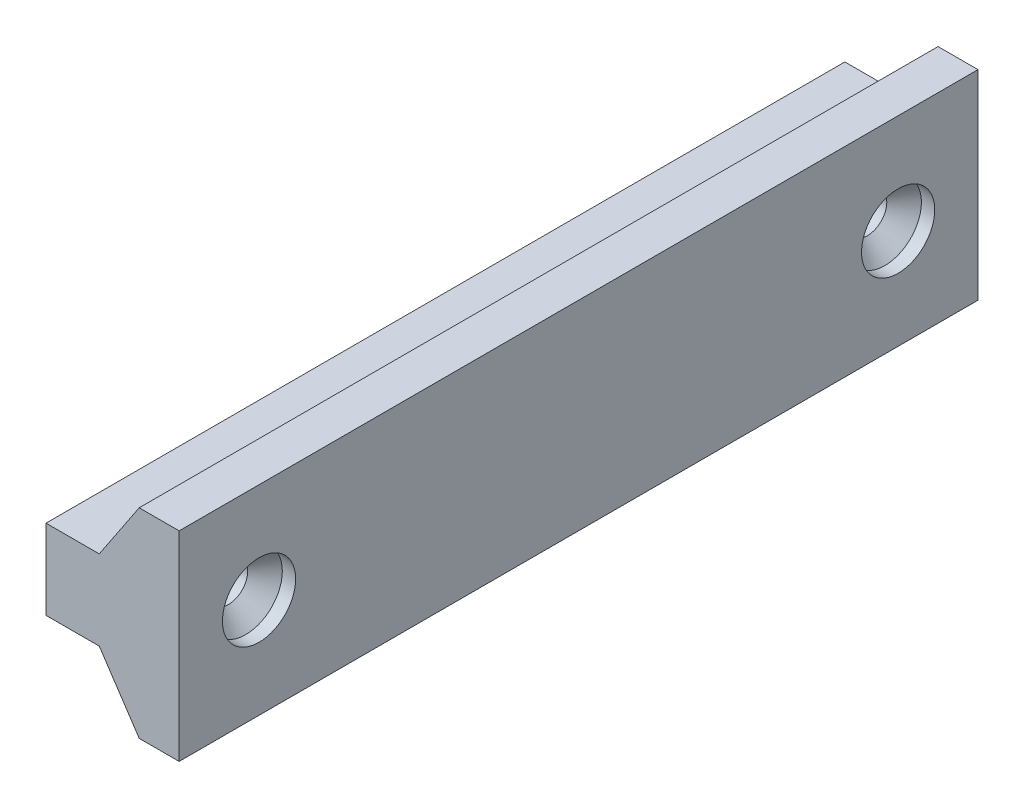
ISO-10303-21;
HEADER;
FILE_DESCRIPTION(('STEP AP214'),'2;1');
FILE_NAME('part.step','',(''),(''),'','','');
FILE_SCHEMA(('AUTOMOTIVE_DESIGN { 1 0 10303 214 1 1 1 1 }'));
ENDSEC;
DATA;
#1=APPLICATION_CONTEXT('core data for automotive mechanical design processes');
#2=APPLICATION_PROTOCOL_DEFINITION('international standard','automotive_design',2000,#1);
#3=PRODUCT_CONTEXT('',#1,'mechanical');
#4=PRODUCT('Part','Part','',(#3));
#5=PRODUCT_RELATED_PRODUCT_CATEGORY('part','',(#4));
#6=PRODUCT_DEFINITION_FORMATION('','',#4);
#7=PRODUCT_DEFINITION_CONTEXT('part definition',#1,'design');
#8=PRODUCT_DEFINITION('design','',#6,#7);
#9=PRODUCT_DEFINITION_SHAPE('','',#8);
#10=(LENGTH_UNIT() NAMED_UNIT(*) SI_UNIT(.MILLI.,.METRE.));
#11=(NAMED_UNIT(*) PLANE_ANGLE_UNIT() SI_UNIT($,.RADIAN.));
#12=(NAMED_UNIT(*) SI_UNIT($,.STERADIAN.) SOLID_ANGLE_UNIT());
#13=UNCERTAINTY_MEASURE_WITH_UNIT(LENGTH_MEASURE(1.E-05),#10,'distance_accuracy_value','');
#14=(GEOMETRIC_REPRESENTATION_CONTEXT(3) GLOBAL_UNCERTAINTY_ASSIGNED_CONTEXT((#13)) GLOBAL_UNIT_ASSIGNED_CONTEXT((#10,
#11,#12)) REPRESENTATION_CONTEXT('',''));
#15=CARTESIAN_POINT('',(0.,0.,0.));
#16=DIRECTION('',(0.,0.,1.));
#17=DIRECTION('',(1.,0.,0.));
#18=AXIS2_PLACEMENT_3D('',#15,#16,#17);
#19=CARTESIAN_POINT('',(-3.,-7.5,30.));
#20=DIRECTION('',(0.,1.,0.));
#21=DIRECTION('',(0.,0.,1.));
#22=AXIS2_PLACEMENT_3D('',#19,#20,#21);
#23=PLANE('',#22);
#24=DIRECTION('',(1.,0.,0.));
#25=VECTOR('',#24,1.);
#26=CARTESIAN_POINT('',(-3.,-7.5,-30.));
#27=LINE('',#26,#25);
#28=CARTESIAN_POINT('',(-3.,-7.5,-30.));
#29=VERTEX_POINT('',#28);
#30=CARTESIAN_POINT('',(0.,-7.5,-30.));
#31=VERTEX_POINT('',#30);
#32=EDGE_CURVE('E140',#29,#31,#27,.T.);
#33=ORIENTED_EDGE('',*,*,#32,.T.);
#34=DIRECTION('',(0.,0.,-1.));
#35=VECTOR('',#34,1.);
#36=CARTESIAN_POINT('',(0.,-7.5,30.));
#37=LINE('',#36,#35);
#38=CARTESIAN_POINT('',(0.,-7.5,30.));
#39=VERTEX_POINT('',#38);
#40=EDGE_CURVE('E11',#39,#31,#37,.T.);
#41=ORIENTED_EDGE('',*,*,#40,.F.);
#42=DIRECTION('',(1.,0.,0.));
#43=VECTOR('',#42,1.);
#44=CARTESIAN_POINT('',(-3.,-7.5,30.));
#45=LINE('',#44,#43);
#46=CARTESIAN_POINT('',(-3.,-7.5,30.));
#47=VERTEX_POINT('',#46);
#48=EDGE_CURVE('E163',#47,#39,#45,.T.);
#49=ORIENTED_EDGE('',*,*,#48,.F.);
#50=DIRECTION('',(0.,0.,-1.));
#51=VECTOR('',#50,1.);
#52=CARTESIAN_POINT('',(-3.,-7.5,30.));
#53=LINE('',#52,#51);
#54=EDGE_CURVE('E136',#47,#29,#53,.T.);
#55=ORIENTED_EDGE('',*,*,#54,.T.);
#56=EDGE_LOOP('',(#33,#41,#49,#55));
#57=FACE_BOUND('',#56,.T.);
#58=ADVANCED_FACE('F39',(#57),#23,.F.);
#59=CARTESIAN_POINT('',(0.,7.5,30.));
#60=DIRECTION('',(-1.,0.,0.));
#61=DIRECTION('',(0.,0.,1.));
#62=AXIS2_PLACEMENT_3D('',#59,#60,#61);
#63=PLANE('',#62);
#64=CARTESIAN_POINT('',(0.,0.,24.));
#65=DIRECTION('',(1.,0.,0.));
#66=DIRECTION('',(0.,0.,-1.));
#67=AXIS2_PLACEMENT_3D('',#64,#65,#66);
#68=CIRCLE('',#67,2.75);
#69=CARTESIAN_POINT('',(0.,0.,21.25));
#70=VERTEX_POINT('',#69);
#71=EDGE_CURVE('E145',#70,#70,#68,.T.);
#72=ORIENTED_EDGE('',*,*,#71,.F.);
#73=EDGE_LOOP('',(#72));
#74=FACE_BOUND('',#73,.T.);
#75=CARTESIAN_POINT('',(0.,0.,-24.));
#76=DIRECTION('',(1.,0.,0.));
#77=DIRECTION('',(0.,0.,-1.));
#78=AXIS2_PLACEMENT_3D('',#75,#76,#77);
#79=CIRCLE('',#78,2.75);
#80=CARTESIAN_POINT('',(0.,0.,-26.75));
#81=VERTEX_POINT('',#80);
#82=EDGE_CURVE('E207',#81,#81,#79,.T.);
#83=ORIENTED_EDGE('',*,*,#82,.F.);
#84=EDGE_LOOP('',(#83));
#85=FACE_BOUND('',#84,.T.);
#86=DIRECTION('',(0.,1.,0.));
#87=VECTOR('',#86,1.);
#88=CARTESIAN_POINT('',(0.,7.5,-30.));
#89=LINE('',#88,#87);
#90=CARTESIAN_POINT('',(0.,7.5,-30.));
#91=VERTEX_POINT('',#90);
#92=EDGE_CURVE('E144',#31,#91,#89,.T.);
#93=ORIENTED_EDGE('',*,*,#92,.T.);
#94=DIRECTION('',(0.,0.,-1.));
#95=VECTOR('',#94,1.);
#96=CARTESIAN_POINT('',(0.,7.5,30.));
#97=LINE('',#96,#95);
#98=CARTESIAN_POINT('',(0.,7.5,30.));
#99=VERTEX_POINT('',#98);
#100=EDGE_CURVE('E48',#99,#91,#97,.T.);
#101=ORIENTED_EDGE('',*,*,#100,.F.);
#102=DIRECTION('',(0.,1.,0.));
#103=VECTOR('',#102,1.);
#104=CARTESIAN_POINT('',(0.,7.5,30.));
#105=LINE('',#104,#103);
#106=EDGE_CURVE('E99',#39,#99,#105,.T.);
#107=ORIENTED_EDGE('',*,*,#106,.F.);
#108=ORIENTED_EDGE('',*,*,#40,.T.);
#109=EDGE_LOOP('',(#93,#101,#107,#108));
#110=FACE_BOUND('',#109,.T.);
#111=ADVANCED_FACE('F249',(#74,#85,#110),#63,.F.);
#112=CARTESIAN_POINT('',(-3.,7.5,30.));
#113=DIRECTION('',(0.,-1.,0.));
#114=DIRECTION('',(0.,0.,-1.));
#115=AXIS2_PLACEMENT_3D('',#112,#113,#114);
#116=PLANE('',#115);
#117=DIRECTION('',(-1.,0.,0.));
#118=VECTOR('',#117,1.);
#119=CARTESIAN_POINT('',(-3.,7.5,-30.));
#120=LINE('',#119,#118);
#121=CARTESIAN_POINT('',(-3.,7.5,-30.));
#122=VERTEX_POINT('',#121);
#123=EDGE_CURVE('E148',#91,#122,#120,.T.);
#124=ORIENTED_EDGE('',*,*,#123,.T.);
#125=DIRECTION('',(0.,0.,-1.));
#126=VECTOR('',#125,1.);
#127=CARTESIAN_POINT('',(-3.,7.5,30.));
#128=LINE('',#127,#126);
#129=CARTESIAN_POINT('',(-3.,7.5,30.));
#130=VERTEX_POINT('',#129);
#131=EDGE_CURVE('E174',#130,#122,#128,.T.);
#132=ORIENTED_EDGE('',*,*,#131,.F.);
#133=DIRECTION('',(-1.,0.,0.));
#134=VECTOR('',#133,1.);
#135=CARTESIAN_POINT('',(-3.,7.5,30.));
#136=LINE('',#135,#134);
#137=EDGE_CURVE('E184',#99,#130,#136,.T.);
#138=ORIENTED_EDGE('',*,*,#137,.F.);
#139=ORIENTED_EDGE('',*,*,#100,.T.);
#140=EDGE_LOOP('',(#124,#132,#138,#139));
#141=FACE_BOUND('',#140,.T.);
#142=ADVANCED_FACE('F182',(#141),#116,.F.);
#143=CARTESIAN_POINT('',(-6.,3.,30.));
#144=DIRECTION('',(0.832050294337844,-0.554700196225229,0.));
#145=DIRECTION('',(0.554700196225229,0.832050294337844,0.));
#146=AXIS2_PLACEMENT_3D('',#143,#144,#145);
#147=PLANE('',#146);
#148=DIRECTION('',(-0.554700196225229,-0.832050294337844,0.));
#149=VECTOR('',#148,1.);
#150=CARTESIAN_POINT('',(-6.,3.,-30.));
#151=LINE('',#150,#149);
#152=CARTESIAN_POINT('',(-6.,3.,-30.));
#153=VERTEX_POINT('',#152);
#154=EDGE_CURVE('E151',#122,#153,#151,.T.);
#155=ORIENTED_EDGE('',*,*,#154,.T.);
#156=DIRECTION('',(0.,0.,-1.));
#157=VECTOR('',#156,1.);
#158=CARTESIAN_POINT('',(-6.,3.,30.));
#159=LINE('',#158,#157);
#160=CARTESIAN_POINT('',(-6.,3.,30.));
#161=VERTEX_POINT('',#160);
#162=EDGE_CURVE('E170',#161,#153,#159,.T.);
#163=ORIENTED_EDGE('',*,*,#162,.F.);
#164=DIRECTION('',(-0.554700196225229,-0.832050294337844,0.));
#165=VECTOR('',#164,1.);
#166=CARTESIAN_POINT('',(-6.,3.,30.));
#167=LINE('',#166,#165);
#168=EDGE_CURVE('E197',#130,#161,#167,.T.);
#169=ORIENTED_EDGE('',*,*,#168,.F.);
#170=ORIENTED_EDGE('',*,*,#131,.T.);
#171=EDGE_LOOP('',(#155,#163,#169,#170));
#172=FACE_BOUND('',#171,.T.);
#173=ADVANCED_FACE('F192',(#172),#147,.F.);
#174=CARTESIAN_POINT('',(-10.,3.,30.));
#175=DIRECTION('',(0.,-1.,0.));
#176=DIRECTION('',(0.,0.,-1.));
#177=AXIS2_PLACEMENT_3D('',#174,#175,#176);
#178=PLANE('',#177);
#179=DIRECTION('',(-1.,0.,0.));
#180=VECTOR('',#179,1.);
#181=CARTESIAN_POINT('',(-10.,3.,-30.));
#182=LINE('',#181,#180);
#183=CARTESIAN_POINT('',(-10.,3.,-30.));
#184=VERTEX_POINT('',#183);
#185=EDGE_CURVE('E154',#153,#184,#182,.T.);
#186=ORIENTED_EDGE('',*,*,#185,.T.);
#187=DIRECTION('',(0.,0.,-1.));
#188=VECTOR('',#187,1.);
#189=CARTESIAN_POINT('',(-10.,3.,30.));
#190=LINE('',#189,#188);
#191=CARTESIAN_POINT('',(-10.,3.,30.));
#192=VERTEX_POINT('',#191);
#193=EDGE_CURVE('E129',#192,#184,#190,.T.);
#194=ORIENTED_EDGE('',*,*,#193,.F.);
#195=DIRECTION('',(-1.,0.,0.));
#196=VECTOR('',#195,1.);
#197=CARTESIAN_POINT('',(-10.,3.,30.));
#198=LINE('',#197,#196);
#199=EDGE_CURVE('E118',#161,#192,#198,.T.);
#200=ORIENTED_EDGE('',*,*,#199,.F.);
#201=ORIENTED_EDGE('',*,*,#162,.T.);
#202=EDGE_LOOP('',(#186,#194,#200,#201));
#203=FACE_BOUND('',#202,.T.);
#204=ADVANCED_FACE('F195',(#203),#178,.F.);
#205=CARTESIAN_POINT('',(-10.,-3.,30.));
#206=DIRECTION('',(1.,0.,0.));
#207=DIRECTION('',(0.,0.,-1.));
#208=AXIS2_PLACEMENT_3D('',#205,#206,#207);
#209=PLANE('',#208);
#210=CARTESIAN_POINT('',(-10.,0.,24.));
#211=DIRECTION('',(1.,0.,0.));
#212=DIRECTION('',(0.,0.,-1.));
#213=AXIS2_PLACEMENT_3D('',#210,#211,#212);
#214=CIRCLE('',#213,1.45);
#215=CARTESIAN_POINT('',(-10.,0.,22.55));
#216=VERTEX_POINT('',#215);
#217=EDGE_CURVE('E226',#216,#216,#214,.T.);
#218=ORIENTED_EDGE('',*,*,#217,.T.);
#219=EDGE_LOOP('',(#218));
#220=FACE_BOUND('',#219,.T.);
#221=CARTESIAN_POINT('',(-10.,0.,-24.));
#222=DIRECTION('',(1.,0.,0.));
#223=DIRECTION('',(0.,0.,-1.));
#224=AXIS2_PLACEMENT_3D('',#221,#222,#223);
#225=CIRCLE('',#224,1.45);
#226=CARTESIAN_POINT('',(-10.,0.,-25.45));
#227=VERTEX_POINT('',#226);
#228=EDGE_CURVE('E211',#227,#227,#225,.T.);
#229=ORIENTED_EDGE('',*,*,#228,.T.);
#230=EDGE_LOOP('',(#229));
#231=FACE_BOUND('',#230,.T.);
#232=DIRECTION('',(0.,-1.,0.));
#233=VECTOR('',#232,1.);
#234=CARTESIAN_POINT('',(-10.,-3.,-30.));
#235=LINE('',#234,#233);
#236=CARTESIAN_POINT('',(-10.,-3.,-30.));
#237=VERTEX_POINT('',#236);
#238=EDGE_CURVE('E127',#184,#237,#235,.T.);
#239=ORIENTED_EDGE('',*,*,#238,.T.);
#240=DIRECTION('',(0.,0.,-1.));
#241=VECTOR('',#240,1.);
#242=CARTESIAN_POINT('',(-10.,-3.,30.));
#243=LINE('',#242,#241);
#244=CARTESIAN_POINT('',(-10.,-3.,30.));
#245=VERTEX_POINT('',#244);
#246=EDGE_CURVE('E124',#245,#237,#243,.T.);
#247=ORIENTED_EDGE('',*,*,#246,.F.);
#248=DIRECTION('',(0.,-1.,0.));
#249=VECTOR('',#248,1.);
#250=CARTESIAN_POINT('',(-10.,-3.,30.));
#251=LINE('',#250,#249);
#252=EDGE_CURVE('E112',#192,#245,#251,.T.);
#253=ORIENTED_EDGE('',*,*,#252,.F.);
#254=ORIENTED_EDGE('',*,*,#193,.T.);
#255=EDGE_LOOP('',(#239,#247,#253,#254));
#256=FACE_BOUND('',#255,.T.);
#257=ADVANCED_FACE('F125',(#220,#231,#256),#209,.F.);
#258=CARTESIAN_POINT('',(-10.,-3.,30.));
#259=DIRECTION('',(0.,1.,0.));
#260=DIRECTION('',(0.,0.,1.));
#261=AXIS2_PLACEMENT_3D('',#258,#259,#260);
#262=PLANE('',#261);
#263=DIRECTION('',(1.,0.,0.));
#264=VECTOR('',#263,1.);
#265=CARTESIAN_POINT('',(-10.,-3.,-30.));
#266=LINE('',#265,#264);
#267=CARTESIAN_POINT('',(-6.,-3.,-30.));
#268=VERTEX_POINT('',#267);
#269=EDGE_CURVE('E85',#237,#268,#266,.T.);
#270=ORIENTED_EDGE('',*,*,#269,.T.);
#271=DIRECTION('',(0.,0.,-1.));
#272=VECTOR('',#271,1.);
#273=CARTESIAN_POINT('',(-6.,-3.,30.));
#274=LINE('',#273,#272);
#275=CARTESIAN_POINT('',(-6.,-3.,30.));
#276=VERTEX_POINT('',#275);
#277=EDGE_CURVE('E130',#276,#268,#274,.T.);
#278=ORIENTED_EDGE('',*,*,#277,.F.);
#279=DIRECTION('',(1.,0.,0.));
#280=VECTOR('',#279,1.);
#281=CARTESIAN_POINT('',(-10.,-3.,30.));
#282=LINE('',#281,#280);
#283=EDGE_CURVE('E116',#245,#276,#282,.T.);
#284=ORIENTED_EDGE('',*,*,#283,.F.);
#285=ORIENTED_EDGE('',*,*,#246,.T.);
#286=EDGE_LOOP('',(#270,#278,#284,#285));
#287=FACE_BOUND('',#286,.T.);
#288=ADVANCED_FACE('F132',(#287),#262,.F.);
#289=CARTESIAN_POINT('',(-6.,-3.,30.));
#290=DIRECTION('',(0.832050294337844,0.554700196225229,0.));
#291=DIRECTION('',(-0.554700196225229,0.832050294337844,0.));
#292=AXIS2_PLACEMENT_3D('',#289,#290,#291);
#293=PLANE('',#292);
#294=DIRECTION('',(0.554700196225229,-0.832050294337844,0.));
#295=VECTOR('',#294,1.);
#296=CARTESIAN_POINT('',(-6.,-3.,-30.));
#297=LINE('',#296,#295);
#298=EDGE_CURVE('E91',#268,#29,#297,.T.);
#299=ORIENTED_EDGE('',*,*,#298,.T.);
#300=ORIENTED_EDGE('',*,*,#54,.F.);
#301=DIRECTION('',(0.554700196225229,-0.832050294337844,0.));
#302=VECTOR('',#301,1.);
#303=CARTESIAN_POINT('',(-6.,-3.,30.));
#304=LINE('',#303,#302);
#305=EDGE_CURVE('E56',#276,#47,#304,.T.);
#306=ORIENTED_EDGE('',*,*,#305,.F.);
#307=ORIENTED_EDGE('',*,*,#277,.T.);
#308=EDGE_LOOP('',(#299,#300,#306,#307));
#309=FACE_BOUND('',#308,.T.);
#310=ADVANCED_FACE('F256',(#309),#293,.F.);
#311=CARTESIAN_POINT('',(0.,0.,30.));
#312=DIRECTION('',(0.,0.,-1.));
#313=DIRECTION('',(-1.,0.,0.));
#314=AXIS2_PLACEMENT_3D('',#311,#312,#313);
#315=PLANE('',#314);
#316=ORIENTED_EDGE('',*,*,#48,.T.);
#317=ORIENTED_EDGE('',*,*,#106,.T.);
#318=ORIENTED_EDGE('',*,*,#137,.T.);
#319=ORIENTED_EDGE('',*,*,#168,.T.);
#320=ORIENTED_EDGE('',*,*,#199,.T.);
#321=ORIENTED_EDGE('',*,*,#252,.T.);
#322=ORIENTED_EDGE('',*,*,#283,.T.);
#323=ORIENTED_EDGE('',*,*,#305,.T.);
#324=EDGE_LOOP('',(#316,#317,#318,#319,#320,#321,#322,#323));
#325=FACE_BOUND('',#324,.T.);
#326=ADVANCED_FACE('F114',(#325),#315,.F.);
#327=CARTESIAN_POINT('',(0.,0.,-30.));
#328=DIRECTION('',(0.,0.,-1.));
#329=DIRECTION('',(-1.,0.,0.));
#330=AXIS2_PLACEMENT_3D('',#327,#328,#329);
#331=PLANE('',#330);
#332=ORIENTED_EDGE('',*,*,#32,.F.);
#333=ORIENTED_EDGE('',*,*,#298,.F.);
#334=ORIENTED_EDGE('',*,*,#269,.F.);
#335=ORIENTED_EDGE('',*,*,#238,.F.);
#336=ORIENTED_EDGE('',*,*,#185,.F.);
#337=ORIENTED_EDGE('',*,*,#154,.F.);
#338=ORIENTED_EDGE('',*,*,#123,.F.);
#339=ORIENTED_EDGE('',*,*,#92,.F.);
#340=EDGE_LOOP('',(#332,#333,#334,#335,#336,#337,#338,#339));
#341=FACE_BOUND('',#340,.T.);
#342=ADVANCED_FACE('F188',(#341),#331,.T.);
#343=CARTESIAN_POINT('',(-1.,0.,-24.));
#344=DIRECTION('',(1.,0.,0.));
#345=DIRECTION('',(0.,0.,-1.));
#346=AXIS2_PLACEMENT_3D('',#343,#344,#345);
#347=CYLINDRICAL_SURFACE('',#346,2.75);
#348=CARTESIAN_POINT('',(-0.999999999999998,0.,-24.));
#349=DIRECTION('',(1.,0.,0.));
#350=DIRECTION('',(0.,0.,-1.));
#351=AXIS2_PLACEMENT_3D('',#348,#349,#350);
#352=CIRCLE('',#351,2.75);
#353=CARTESIAN_POINT('',(-0.999999999999998,0.,-26.75));
#354=VERTEX_POINT('',#353);
#355=EDGE_CURVE('E222',#354,#354,#352,.T.);
#356=ORIENTED_EDGE('',*,*,#355,.F.);
#357=EDGE_LOOP('',(#356));
#358=FACE_BOUND('',#357,.T.);
#359=ORIENTED_EDGE('',*,*,#82,.T.);
#360=EDGE_LOOP('',(#359));
#361=FACE_BOUND('',#360,.T.);
#362=ADVANCED_FACE('F245',(#358,#361),#347,.F.);
#363=CARTESIAN_POINT('',(-1.,0.,24.));
#364=DIRECTION('',(1.,0.,0.));
#365=DIRECTION('',(0.,0.,-1.));
#366=AXIS2_PLACEMENT_3D('',#363,#364,#365);
#367=CYLINDRICAL_SURFACE('',#366,2.75);
#368=CARTESIAN_POINT('',(-0.999999999999998,0.,24.));
#369=DIRECTION('',(1.,0.,0.));
#370=DIRECTION('',(0.,0.,-1.));
#371=AXIS2_PLACEMENT_3D('',#368,#369,#370);
#372=CIRCLE('',#371,2.75);
#373=CARTESIAN_POINT('',(-0.999999999999998,0.,21.25));
#374=VERTEX_POINT('',#373);
#375=EDGE_CURVE('E234',#374,#374,#372,.T.);
#376=ORIENTED_EDGE('',*,*,#375,.F.);
#377=EDGE_LOOP('',(#376));
#378=FACE_BOUND('',#377,.T.);
#379=ORIENTED_EDGE('',*,*,#71,.T.);
#380=EDGE_LOOP('',(#379));
#381=FACE_BOUND('',#380,.T.);
#382=ADVANCED_FACE('F241',(#378,#381),#367,.F.);
#383=CARTESIAN_POINT('',(-1.,0.,-24.));
#384=DIRECTION('',(1.,0.,0.));
#385=DIRECTION('',(0.,0.,-1.));
#386=AXIS2_PLACEMENT_3D('',#383,#384,#385);
#387=CYLINDRICAL_SURFACE('',#386,1.44999999999999);
#388=ORIENTED_EDGE('',*,*,#228,.F.);
#389=EDGE_LOOP('',(#388));
#390=FACE_BOUND('',#389,.T.);
#391=CARTESIAN_POINT('',(-2.30000000000001,0.,-24.));
#392=DIRECTION('',(1.,0.,0.));
#393=DIRECTION('',(0.,0.,-1.));
#394=AXIS2_PLACEMENT_3D('',#391,#392,#393);
#395=CIRCLE('',#394,1.44999999999999);
#396=CARTESIAN_POINT('',(-2.30000000000001,0.,-25.45));
#397=VERTEX_POINT('',#396);
#398=EDGE_CURVE('E218',#397,#397,#395,.T.);
#399=ORIENTED_EDGE('',*,*,#398,.T.);
#400=EDGE_LOOP('',(#399));
#401=FACE_BOUND('',#400,.T.);
#402=ADVANCED_FACE('F244',(#390,#401),#387,.F.);
#403=CARTESIAN_POINT('',(-0.999999999999998,0.,-24.));
#404=DIRECTION('',(1.,0.,0.));
#405=DIRECTION('',(0.,0.,-1.));
#406=AXIS2_PLACEMENT_3D('',#403,#404,#405);
#407=CONICAL_SURFACE('',#406,2.75,0.785398163397448);
#408=ORIENTED_EDGE('',*,*,#398,.F.);
#409=EDGE_LOOP('',(#408));
#410=FACE_BOUND('',#409,.T.);
#411=ORIENTED_EDGE('',*,*,#355,.T.);
#412=EDGE_LOOP('',(#411));
#413=FACE_BOUND('',#412,.T.);
#414=ADVANCED_FACE('F338',(#410,#413),#407,.F.);
#415=CARTESIAN_POINT('',(-1.,0.,24.));
#416=DIRECTION('',(1.,0.,0.));
#417=DIRECTION('',(0.,0.,-1.));
#418=AXIS2_PLACEMENT_3D('',#415,#416,#417);
#419=CYLINDRICAL_SURFACE('',#418,1.44999999999999);
#420=ORIENTED_EDGE('',*,*,#217,.F.);
#421=EDGE_LOOP('',(#420));
#422=FACE_BOUND('',#421,.T.);
#423=CARTESIAN_POINT('',(-2.30000000000001,0.,24.));
#424=DIRECTION('',(1.,0.,0.));
#425=DIRECTION('',(0.,0.,-1.));
#426=AXIS2_PLACEMENT_3D('',#423,#424,#425);
#427=CIRCLE('',#426,1.44999999999999);
#428=CARTESIAN_POINT('',(-2.30000000000001,0.,22.55));
#429=VERTEX_POINT('',#428);
#430=EDGE_CURVE('E230',#429,#429,#427,.T.);
#431=ORIENTED_EDGE('',*,*,#430,.T.);
#432=EDGE_LOOP('',(#431));
#433=FACE_BOUND('',#432,.T.);
#434=ADVANCED_FACE('F346',(#422,#433),#419,.F.);
#435=CARTESIAN_POINT('',(-0.999999999999998,0.,24.));
#436=DIRECTION('',(1.,0.,0.));
#437=DIRECTION('',(0.,0.,-1.));
#438=AXIS2_PLACEMENT_3D('',#435,#436,#437);
#439=CONICAL_SURFACE('',#438,2.75,0.785398163397448);
#440=ORIENTED_EDGE('',*,*,#430,.F.);
#441=EDGE_LOOP('',(#440));
#442=FACE_BOUND('',#441,.T.);
#443=ORIENTED_EDGE('',*,*,#375,.T.);
#444=EDGE_LOOP('',(#443));
#445=FACE_BOUND('',#444,.T.);
#446=ADVANCED_FACE('F239',(#442,#445),#439,.F.);
#447=CLOSED_SHELL('',(#58,#111,#142,#173,#204,#257,#288,#310,#326,#342,#362,#382,#402,#414,#434,#446));
#448=MANIFOLD_SOLID_BREP('B2',#447);
#449=ADVANCED_BREP_SHAPE_REPRESENTATION('',(#18,#448),#14);
#450=SHAPE_DEFINITION_REPRESENTATION(#9,#449);
ENDSEC;
END-ISO-10303-21;
